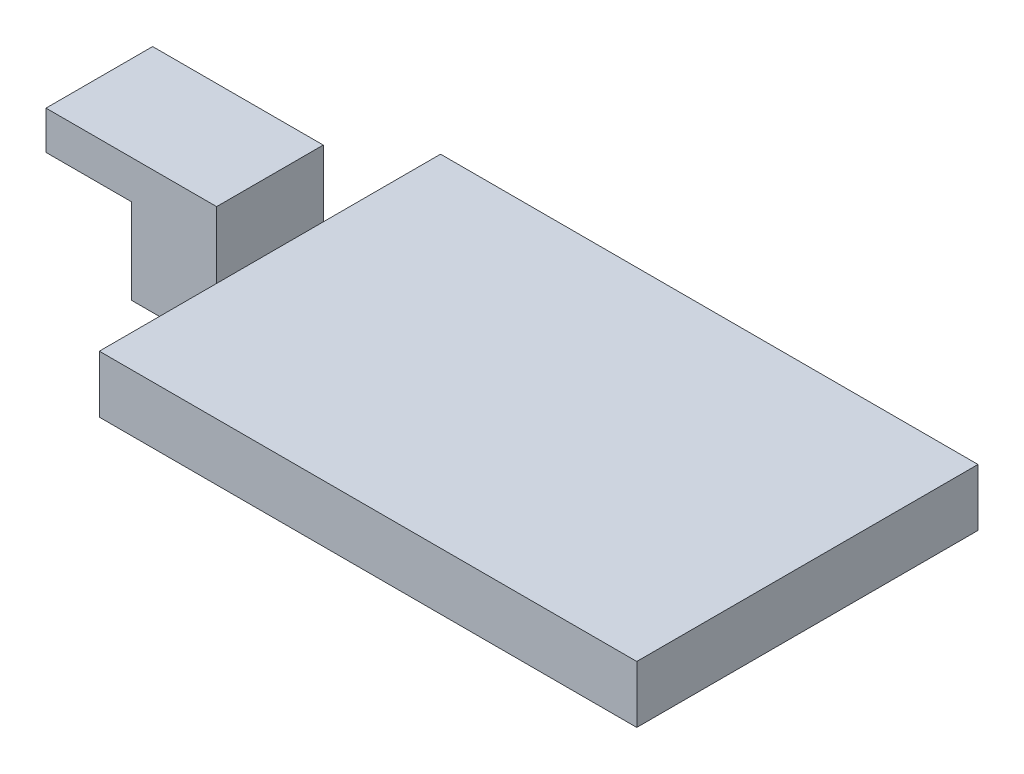
ISO-10303-21;
HEADER;
FILE_DESCRIPTION(('STEP AP214'),'2;1');
FILE_NAME('part.step','',(''),(''),'','','');
FILE_SCHEMA(('AUTOMOTIVE_DESIGN { 1 0 10303 214 1 1 1 1 }'));
ENDSEC;
DATA;
#1=APPLICATION_CONTEXT('core data for automotive mechanical design processes');
#2=APPLICATION_PROTOCOL_DEFINITION('international standard','automotive_design',2000,#1);
#3=PRODUCT_CONTEXT('',#1,'mechanical');
#4=PRODUCT('Part','Part','',(#3));
#5=PRODUCT_RELATED_PRODUCT_CATEGORY('part','',(#4));
#6=PRODUCT_DEFINITION_FORMATION('','',#4);
#7=PRODUCT_DEFINITION_CONTEXT('part definition',#1,'design');
#8=PRODUCT_DEFINITION('design','',#6,#7);
#9=PRODUCT_DEFINITION_SHAPE('','',#8);
#10=(LENGTH_UNIT() NAMED_UNIT(*) SI_UNIT(.MILLI.,.METRE.));
#11=(NAMED_UNIT(*) PLANE_ANGLE_UNIT() SI_UNIT($,.RADIAN.));
#12=(NAMED_UNIT(*) SI_UNIT($,.STERADIAN.) SOLID_ANGLE_UNIT());
#13=UNCERTAINTY_MEASURE_WITH_UNIT(LENGTH_MEASURE(1.E-05),#10,'distance_accuracy_value','');
#14=(GEOMETRIC_REPRESENTATION_CONTEXT(3) GLOBAL_UNCERTAINTY_ASSIGNED_CONTEXT((#13)) GLOBAL_UNIT_ASSIGNED_CONTEXT((#10,
#11,#12)) REPRESENTATION_CONTEXT('',''));
#15=CARTESIAN_POINT('',(0.,0.,0.));
#16=DIRECTION('',(0.,0.,1.));
#17=DIRECTION('',(1.,0.,0.));
#18=AXIS2_PLACEMENT_3D('',#15,#16,#17);
#19=CARTESIAN_POINT('',(10.16,2.286,0.));
#20=DIRECTION('',(-1.,0.,0.));
#21=DIRECTION('',(0.,0.,1.));
#22=AXIS2_PLACEMENT_3D('',#19,#20,#21);
#23=PLANE('',#22);
#24=DIRECTION('',(0.,0.,1.));
#25=VECTOR('',#24,1.);
#26=CARTESIAN_POINT('',(10.16,-1.6764,-13.335));
#27=LINE('',#26,#25);
#28=CARTESIAN_POINT('',(10.16,-1.6764,-6.35));
#29=VERTEX_POINT('',#28);
#30=CARTESIAN_POINT('',(10.16,-1.6764,0.));
#31=VERTEX_POINT('',#30);
#32=EDGE_CURVE('E11',#29,#31,#27,.T.);
#33=ORIENTED_EDGE('',*,*,#32,.F.);
#34=DIRECTION('',(0.,-1.,0.));
#35=VECTOR('',#34,1.);
#36=CARTESIAN_POINT('',(10.16,2.286,-6.35));
#37=LINE('',#36,#35);
#38=CARTESIAN_POINT('',(10.16,2.286,-6.35));
#39=VERTEX_POINT('',#38);
#40=EDGE_CURVE('E282',#39,#29,#37,.T.);
#41=ORIENTED_EDGE('',*,*,#40,.F.);
#42=DIRECTION('',(0.,0.,-1.));
#43=VECTOR('',#42,1.);
#44=CARTESIAN_POINT('',(10.16,2.286,0.));
#45=LINE('',#44,#43);
#46=CARTESIAN_POINT('',(10.16,2.286,0.));
#47=VERTEX_POINT('',#46);
#48=EDGE_CURVE('E263',#47,#39,#45,.T.);
#49=ORIENTED_EDGE('',*,*,#48,.F.);
#50=DIRECTION('',(0.,-1.,0.));
#51=VECTOR('',#50,1.);
#52=CARTESIAN_POINT('',(10.16,2.286,0.));
#53=LINE('',#52,#51);
#54=EDGE_CURVE('E285',#47,#31,#53,.T.);
#55=ORIENTED_EDGE('',*,*,#54,.T.);
#56=EDGE_LOOP('',(#33,#41,#49,#55));
#57=FACE_BOUND('',#56,.T.);
#58=ADVANCED_FACE('F45',(#57),#23,.F.);
#59=CARTESIAN_POINT('',(0.,2.286,0.));
#60=DIRECTION('',(1.,0.,0.));
#61=DIRECTION('',(0.,0.,-1.));
#62=AXIS2_PLACEMENT_3D('',#59,#60,#61);
#63=PLANE('',#62);
#64=DIRECTION('',(0.,0.,1.));
#65=VECTOR('',#64,1.);
#66=CARTESIAN_POINT('',(0.,0.203199999999999,-6.0452));
#67=LINE('',#66,#65);
#68=CARTESIAN_POINT('',(0.,0.203199999999999,-6.0452));
#69=VERTEX_POINT('',#68);
#70=CARTESIAN_POINT('',(0.,0.2032,-0.2032));
#71=VERTEX_POINT('',#70);
#72=EDGE_CURVE('E231',#69,#71,#67,.T.);
#73=ORIENTED_EDGE('',*,*,#72,.F.);
#74=DIRECTION('',(0.,-1.,0.));
#75=VECTOR('',#74,1.);
#76=CARTESIAN_POINT('',(0.,1.9812,-6.0452));
#77=LINE('',#76,#75);
#78=CARTESIAN_POINT('',(0.,1.9812,-6.0452));
#79=VERTEX_POINT('',#78);
#80=EDGE_CURVE('E210',#79,#69,#77,.T.);
#81=ORIENTED_EDGE('',*,*,#80,.F.);
#82=DIRECTION('',(0.,0.,-1.));
#83=VECTOR('',#82,1.);
#84=CARTESIAN_POINT('',(0.,1.9812,-6.0452));
#85=LINE('',#84,#83);
#86=CARTESIAN_POINT('',(0.,1.9812,-0.2032));
#87=VERTEX_POINT('',#86);
#88=EDGE_CURVE('E216',#87,#79,#85,.T.);
#89=ORIENTED_EDGE('',*,*,#88,.F.);
#90=DIRECTION('',(0.,1.,0.));
#91=VECTOR('',#90,1.);
#92=CARTESIAN_POINT('',(0.,1.9812,-0.2032));
#93=LINE('',#92,#91);
#94=EDGE_CURVE('E235',#71,#87,#93,.T.);
#95=ORIENTED_EDGE('',*,*,#94,.F.);
#96=EDGE_LOOP('',(#73,#81,#89,#95));
#97=FACE_BOUND('',#96,.T.);
#98=DIRECTION('',(0.,0.,1.));
#99=VECTOR('',#98,1.);
#100=CARTESIAN_POINT('',(0.,0.,0.));
#101=LINE('',#100,#99);
#102=CARTESIAN_POINT('',(0.,0.,-6.35));
#103=VERTEX_POINT('',#102);
#104=CARTESIAN_POINT('',(0.,0.,0.));
#105=VERTEX_POINT('',#104);
#106=EDGE_CURVE('E245',#103,#105,#101,.T.);
#107=ORIENTED_EDGE('',*,*,#106,.T.);
#108=DIRECTION('',(0.,-1.,0.));
#109=VECTOR('',#108,1.);
#110=CARTESIAN_POINT('',(0.,2.286,0.));
#111=LINE('',#110,#109);
#112=CARTESIAN_POINT('',(0.,2.286,0.));
#113=VERTEX_POINT('',#112);
#114=EDGE_CURVE('E49',#113,#105,#111,.T.);
#115=ORIENTED_EDGE('',*,*,#114,.F.);
#116=DIRECTION('',(0.,0.,1.));
#117=VECTOR('',#116,1.);
#118=CARTESIAN_POINT('',(0.,2.286,0.));
#119=LINE('',#118,#117);
#120=CARTESIAN_POINT('',(0.,2.286,-6.35));
#121=VERTEX_POINT('',#120);
#122=EDGE_CURVE('E255',#121,#113,#119,.T.);
#123=ORIENTED_EDGE('',*,*,#122,.F.);
#124=DIRECTION('',(0.,-1.,0.));
#125=VECTOR('',#124,1.);
#126=CARTESIAN_POINT('',(0.,2.286,-6.35));
#127=LINE('',#126,#125);
#128=EDGE_CURVE('E269',#121,#103,#127,.T.);
#129=ORIENTED_EDGE('',*,*,#128,.T.);
#130=EDGE_LOOP('',(#107,#115,#123,#129));
#131=FACE_BOUND('',#130,.T.);
#132=ADVANCED_FACE('F47',(#97,#131),#63,.F.);
#133=CARTESIAN_POINT('',(0.,2.286,0.));
#134=DIRECTION('',(0.,0.,-1.));
#135=DIRECTION('',(-1.,0.,0.));
#136=AXIS2_PLACEMENT_3D('',#133,#134,#135);
#137=PLANE('',#136);
#138=DIRECTION('',(1.,0.,0.));
#139=VECTOR('',#138,1.);
#140=CARTESIAN_POINT('',(0.,0.,0.));
#141=LINE('',#140,#139);
#142=CARTESIAN_POINT('',(5.08,0.,0.));
#143=VERTEX_POINT('',#142);
#144=EDGE_CURVE('E273',#105,#143,#141,.T.);
#145=ORIENTED_EDGE('',*,*,#144,.T.);
#146=DIRECTION('',(0.,1.,0.));
#147=VECTOR('',#146,1.);
#148=CARTESIAN_POINT('',(5.08,-5.08,0.));
#149=LINE('',#148,#147);
#150=CARTESIAN_POINT('',(5.08,-5.08,0.));
#151=VERTEX_POINT('',#150);
#152=EDGE_CURVE('E206',#151,#143,#149,.T.);
#153=ORIENTED_EDGE('',*,*,#152,.F.);
#154=DIRECTION('',(-1.,0.,0.));
#155=VECTOR('',#154,1.);
#156=CARTESIAN_POINT('',(10.16,-5.08,0.));
#157=LINE('',#156,#155);
#158=CARTESIAN_POINT('',(10.16,-5.08,0.));
#159=VERTEX_POINT('',#158);
#160=EDGE_CURVE('E187',#159,#151,#157,.T.);
#161=ORIENTED_EDGE('',*,*,#160,.F.);
#162=EDGE_CURVE('E284',#31,#159,#53,.T.);
#163=ORIENTED_EDGE('',*,*,#162,.F.);
#164=ORIENTED_EDGE('',*,*,#54,.F.);
#165=DIRECTION('',(1.,0.,0.));
#166=VECTOR('',#165,1.);
#167=CARTESIAN_POINT('',(0.,2.286,0.));
#168=LINE('',#167,#166);
#169=EDGE_CURVE('E259',#113,#47,#168,.T.);
#170=ORIENTED_EDGE('',*,*,#169,.F.);
#171=ORIENTED_EDGE('',*,*,#114,.T.);
#172=EDGE_LOOP('',(#145,#153,#161,#163,#164,#170,#171));
#173=FACE_BOUND('',#172,.T.);
#174=ADVANCED_FACE('F346',(#173),#137,.F.);
#175=CARTESIAN_POINT('',(0.,2.286,-6.35));
#176=DIRECTION('',(0.,0.,1.));
#177=DIRECTION('',(1.,0.,0.));
#178=AXIS2_PLACEMENT_3D('',#175,#176,#177);
#179=PLANE('',#178);
#180=ORIENTED_EDGE('',*,*,#40,.T.);
#181=CARTESIAN_POINT('',(10.16,-5.08,-6.35));
#182=VERTEX_POINT('',#181);
#183=EDGE_CURVE('E281',#29,#182,#37,.T.);
#184=ORIENTED_EDGE('',*,*,#183,.T.);
#185=DIRECTION('',(1.,0.,0.));
#186=VECTOR('',#185,1.);
#187=CARTESIAN_POINT('',(10.16,-5.08,-6.35));
#188=LINE('',#187,#186);
#189=CARTESIAN_POINT('',(5.08,-5.08,-6.35));
#190=VERTEX_POINT('',#189);
#191=EDGE_CURVE('E198',#190,#182,#188,.T.);
#192=ORIENTED_EDGE('',*,*,#191,.F.);
#193=DIRECTION('',(0.,1.,0.));
#194=VECTOR('',#193,1.);
#195=CARTESIAN_POINT('',(5.08,-5.08,-6.35));
#196=LINE('',#195,#194);
#197=CARTESIAN_POINT('',(5.08,0.,-6.35));
#198=VERTEX_POINT('',#197);
#199=EDGE_CURVE('E201',#190,#198,#196,.T.);
#200=ORIENTED_EDGE('',*,*,#199,.T.);
#201=DIRECTION('',(-1.,0.,0.));
#202=VECTOR('',#201,1.);
#203=CARTESIAN_POINT('',(0.,0.,-6.35));
#204=LINE('',#203,#202);
#205=EDGE_CURVE('E260',#198,#103,#204,.T.);
#206=ORIENTED_EDGE('',*,*,#205,.T.);
#207=ORIENTED_EDGE('',*,*,#128,.F.);
#208=DIRECTION('',(-1.,0.,0.));
#209=VECTOR('',#208,1.);
#210=CARTESIAN_POINT('',(0.,2.286,-6.35));
#211=LINE('',#210,#209);
#212=EDGE_CURVE('E266',#39,#121,#211,.T.);
#213=ORIENTED_EDGE('',*,*,#212,.F.);
#214=EDGE_LOOP('',(#180,#184,#192,#200,#206,#207,#213));
#215=FACE_BOUND('',#214,.T.);
#216=ADVANCED_FACE('F334',(#215),#179,.F.);
#217=CARTESIAN_POINT('',(0.,2.286,0.));
#218=DIRECTION('',(0.,-1.,0.));
#219=DIRECTION('',(0.,0.,-1.));
#220=AXIS2_PLACEMENT_3D('',#217,#218,#219);
#221=PLANE('',#220);
#222=ORIENTED_EDGE('',*,*,#122,.T.);
#223=ORIENTED_EDGE('',*,*,#169,.T.);
#224=ORIENTED_EDGE('',*,*,#48,.T.);
#225=ORIENTED_EDGE('',*,*,#212,.T.);
#226=EDGE_LOOP('',(#222,#223,#224,#225));
#227=FACE_BOUND('',#226,.T.);
#228=ADVANCED_FACE('F348',(#227),#221,.F.);
#229=CARTESIAN_POINT('',(0.,0.,0.));
#230=DIRECTION('',(0.,-1.,0.));
#231=DIRECTION('',(0.,0.,-1.));
#232=AXIS2_PLACEMENT_3D('',#229,#230,#231);
#233=PLANE('',#232);
#234=DIRECTION('',(0.,0.,-1.));
#235=VECTOR('',#234,1.);
#236=CARTESIAN_POINT('',(5.08,0.,-6.35));
#237=LINE('',#236,#235);
#238=EDGE_CURVE('E70',#143,#198,#237,.T.);
#239=ORIENTED_EDGE('',*,*,#238,.F.);
#240=ORIENTED_EDGE('',*,*,#144,.F.);
#241=ORIENTED_EDGE('',*,*,#106,.F.);
#242=ORIENTED_EDGE('',*,*,#205,.F.);
#243=EDGE_LOOP('',(#239,#240,#241,#242));
#244=FACE_BOUND('',#243,.T.);
#245=ADVANCED_FACE('F345',(#244),#233,.T.);
#246=CARTESIAN_POINT('',(8.89,1.9812,-6.0452));
#247=DIRECTION('',(0.,0.,-1.));
#248=DIRECTION('',(0.,1.,0.));
#249=AXIS2_PLACEMENT_3D('',#246,#247,#248);
#250=PLANE('',#249);
#251=ORIENTED_EDGE('',*,*,#80,.T.);
#252=DIRECTION('',(-1.,0.,0.));
#253=VECTOR('',#252,1.);
#254=CARTESIAN_POINT('',(8.89,0.203199999999999,-6.0452));
#255=LINE('',#254,#253);
#256=CARTESIAN_POINT('',(8.89,0.203199999999999,-6.0452));
#257=VERTEX_POINT('',#256);
#258=EDGE_CURVE('E228',#257,#69,#255,.T.);
#259=ORIENTED_EDGE('',*,*,#258,.F.);
#260=DIRECTION('',(0.,-1.,0.));
#261=VECTOR('',#260,1.);
#262=CARTESIAN_POINT('',(8.89,1.9812,-6.0452));
#263=LINE('',#262,#261);
#264=CARTESIAN_POINT('',(8.89,1.9812,-6.0452));
#265=VERTEX_POINT('',#264);
#266=EDGE_CURVE('E211',#265,#257,#263,.T.);
#267=ORIENTED_EDGE('',*,*,#266,.F.);
#268=DIRECTION('',(-1.,0.,0.));
#269=VECTOR('',#268,1.);
#270=CARTESIAN_POINT('',(8.89,1.9812,-6.0452));
#271=LINE('',#270,#269);
#272=EDGE_CURVE('E242',#265,#79,#271,.T.);
#273=ORIENTED_EDGE('',*,*,#272,.T.);
#274=EDGE_LOOP('',(#251,#259,#267,#273));
#275=FACE_BOUND('',#274,.T.);
#276=ADVANCED_FACE('F370',(#275),#250,.F.);
#277=CARTESIAN_POINT('',(8.89,1.9812,-6.0452));
#278=DIRECTION('',(0.,1.,0.));
#279=DIRECTION('',(0.,0.,1.));
#280=AXIS2_PLACEMENT_3D('',#277,#278,#279);
#281=PLANE('',#280);
#282=ORIENTED_EDGE('',*,*,#88,.T.);
#283=ORIENTED_EDGE('',*,*,#272,.F.);
#284=DIRECTION('',(0.,0.,-1.));
#285=VECTOR('',#284,1.);
#286=CARTESIAN_POINT('',(8.89,1.9812,-6.0452));
#287=LINE('',#286,#285);
#288=CARTESIAN_POINT('',(8.89,1.9812,-0.2032));
#289=VERTEX_POINT('',#288);
#290=EDGE_CURVE('E224',#289,#265,#287,.T.);
#291=ORIENTED_EDGE('',*,*,#290,.F.);
#292=DIRECTION('',(-1.,0.,0.));
#293=VECTOR('',#292,1.);
#294=CARTESIAN_POINT('',(8.89,1.9812,-0.2032));
#295=LINE('',#294,#293);
#296=EDGE_CURVE('E246',#289,#87,#295,.T.);
#297=ORIENTED_EDGE('',*,*,#296,.T.);
#298=EDGE_LOOP('',(#282,#283,#291,#297));
#299=FACE_BOUND('',#298,.T.);
#300=ADVANCED_FACE('F374',(#299),#281,.F.);
#301=CARTESIAN_POINT('',(8.89,1.9812,-0.2032));
#302=DIRECTION('',(0.,0.,1.));
#303=DIRECTION('',(1.,0.,0.));
#304=AXIS2_PLACEMENT_3D('',#301,#302,#303);
#305=PLANE('',#304);
#306=ORIENTED_EDGE('',*,*,#94,.T.);
#307=ORIENTED_EDGE('',*,*,#296,.F.);
#308=DIRECTION('',(0.,1.,0.));
#309=VECTOR('',#308,1.);
#310=CARTESIAN_POINT('',(8.89,1.9812,-0.2032));
#311=LINE('',#310,#309);
#312=CARTESIAN_POINT('',(8.89,0.2032,-0.2032));
#313=VERTEX_POINT('',#312);
#314=EDGE_CURVE('E220',#313,#289,#311,.T.);
#315=ORIENTED_EDGE('',*,*,#314,.F.);
#316=DIRECTION('',(-1.,0.,0.));
#317=VECTOR('',#316,1.);
#318=CARTESIAN_POINT('',(8.89,0.2032,-0.2032));
#319=LINE('',#318,#317);
#320=EDGE_CURVE('E249',#313,#71,#319,.T.);
#321=ORIENTED_EDGE('',*,*,#320,.T.);
#322=EDGE_LOOP('',(#306,#307,#315,#321));
#323=FACE_BOUND('',#322,.T.);
#324=ADVANCED_FACE('F380',(#323),#305,.F.);
#325=CARTESIAN_POINT('',(8.89,0.203199999999999,-6.0452));
#326=DIRECTION('',(0.,-1.,0.));
#327=DIRECTION('',(0.,0.,-1.));
#328=AXIS2_PLACEMENT_3D('',#325,#326,#327);
#329=PLANE('',#328);
#330=ORIENTED_EDGE('',*,*,#72,.T.);
#331=ORIENTED_EDGE('',*,*,#320,.F.);
#332=DIRECTION('',(0.,0.,1.));
#333=VECTOR('',#332,1.);
#334=CARTESIAN_POINT('',(8.89,0.203199999999999,-6.0452));
#335=LINE('',#334,#333);
#336=EDGE_CURVE('E215',#257,#313,#335,.T.);
#337=ORIENTED_EDGE('',*,*,#336,.F.);
#338=ORIENTED_EDGE('',*,*,#258,.T.);
#339=EDGE_LOOP('',(#330,#331,#337,#338));
#340=FACE_BOUND('',#339,.T.);
#341=ADVANCED_FACE('F376',(#340),#329,.F.);
#342=CARTESIAN_POINT('',(8.89,0.,0.));
#343=DIRECTION('',(-1.,0.,0.));
#344=DIRECTION('',(0.,0.,1.));
#345=AXIS2_PLACEMENT_3D('',#342,#343,#344);
#346=PLANE('',#345);
#347=ORIENTED_EDGE('',*,*,#266,.T.);
#348=ORIENTED_EDGE('',*,*,#336,.T.);
#349=ORIENTED_EDGE('',*,*,#314,.T.);
#350=ORIENTED_EDGE('',*,*,#290,.T.);
#351=EDGE_LOOP('',(#347,#348,#349,#350));
#352=FACE_BOUND('',#351,.T.);
#353=ADVANCED_FACE('F379',(#352),#346,.T.);
#354=CARTESIAN_POINT('',(5.08,-5.08,-6.35));
#355=DIRECTION('',(1.,0.,0.));
#356=DIRECTION('',(0.,0.,-1.));
#357=AXIS2_PLACEMENT_3D('',#354,#355,#356);
#358=PLANE('',#357);
#359=ORIENTED_EDGE('',*,*,#238,.T.);
#360=ORIENTED_EDGE('',*,*,#199,.F.);
#361=DIRECTION('',(0.,0.,-1.));
#362=VECTOR('',#361,1.);
#363=CARTESIAN_POINT('',(5.08,-5.08,-6.35));
#364=LINE('',#363,#362);
#365=EDGE_CURVE('E195',#151,#190,#364,.T.);
#366=ORIENTED_EDGE('',*,*,#365,.F.);
#367=ORIENTED_EDGE('',*,*,#152,.T.);
#368=EDGE_LOOP('',(#359,#360,#366,#367));
#369=FACE_BOUND('',#368,.T.);
#370=ADVANCED_FACE('F339',(#369),#358,.F.);
#371=CARTESIAN_POINT('',(0.,-5.08,0.));
#372=DIRECTION('',(0.,-1.,0.));
#373=DIRECTION('',(0.,0.,-1.));
#374=AXIS2_PLACEMENT_3D('',#371,#372,#373);
#375=PLANE('',#374);
#376=ORIENTED_EDGE('',*,*,#191,.T.);
#377=DIRECTION('',(0.,0.,-1.));
#378=VECTOR('',#377,1.);
#379=CARTESIAN_POINT('',(10.16,-5.08,-13.335));
#380=LINE('',#379,#378);
#381=CARTESIAN_POINT('',(10.16,-5.08,-13.335));
#382=VERTEX_POINT('',#381);
#383=EDGE_CURVE('E307',#182,#382,#380,.T.);
#384=ORIENTED_EDGE('',*,*,#383,.T.);
#385=DIRECTION('',(-1.,0.,0.));
#386=VECTOR('',#385,1.);
#387=CARTESIAN_POINT('',(42.164,-5.08,-13.335));
#388=LINE('',#387,#386);
#389=CARTESIAN_POINT('',(42.164,-5.08,-13.335));
#390=VERTEX_POINT('',#389);
#391=EDGE_CURVE('E313',#390,#382,#388,.T.);
#392=ORIENTED_EDGE('',*,*,#391,.F.);
#393=DIRECTION('',(0.,0.,-1.));
#394=VECTOR('',#393,1.);
#395=CARTESIAN_POINT('',(42.164,-5.08,-13.335));
#396=LINE('',#395,#394);
#397=CARTESIAN_POINT('',(42.164,-5.08,6.985));
#398=VERTEX_POINT('',#397);
#399=EDGE_CURVE('E173',#398,#390,#396,.T.);
#400=ORIENTED_EDGE('',*,*,#399,.F.);
#401=DIRECTION('',(-1.,0.,0.));
#402=VECTOR('',#401,1.);
#403=CARTESIAN_POINT('',(42.164,-5.08,6.985));
#404=LINE('',#403,#402);
#405=CARTESIAN_POINT('',(10.16,-5.08,6.985));
#406=VERTEX_POINT('',#405);
#407=EDGE_CURVE('E189',#398,#406,#404,.T.);
#408=ORIENTED_EDGE('',*,*,#407,.T.);
#409=EDGE_CURVE('E178',#406,#159,#380,.T.);
#410=ORIENTED_EDGE('',*,*,#409,.T.);
#411=ORIENTED_EDGE('',*,*,#160,.T.);
#412=ORIENTED_EDGE('',*,*,#365,.T.);
#413=EDGE_LOOP('',(#376,#384,#392,#400,#408,#410,#411,#412));
#414=FACE_BOUND('',#413,.T.);
#415=ADVANCED_FACE('F303',(#414),#375,.T.);
#416=CARTESIAN_POINT('',(10.16,0.,0.));
#417=DIRECTION('',(1.,0.,0.));
#418=DIRECTION('',(0.,0.,-1.));
#419=AXIS2_PLACEMENT_3D('',#416,#417,#418);
#420=PLANE('',#419);
#421=CARTESIAN_POINT('',(10.16,-1.6764,6.985));
#422=VERTEX_POINT('',#421);
#423=EDGE_CURVE('E57',#31,#422,#27,.T.);
#424=ORIENTED_EDGE('',*,*,#423,.F.);
#425=ORIENTED_EDGE('',*,*,#162,.T.);
#426=ORIENTED_EDGE('',*,*,#409,.F.);
#427=DIRECTION('',(0.,-1.,0.));
#428=VECTOR('',#427,1.);
#429=CARTESIAN_POINT('',(10.16,-5.08,6.985));
#430=LINE('',#429,#428);
#431=EDGE_CURVE('E310',#422,#406,#430,.T.);
#432=ORIENTED_EDGE('',*,*,#431,.F.);
#433=EDGE_LOOP('',(#424,#425,#426,#432));
#434=FACE_BOUND('',#433,.T.);
#435=ADVANCED_FACE('F298',(#434),#420,.F.);
#436=CARTESIAN_POINT('',(42.164,-5.08,-13.335));
#437=DIRECTION('',(0.,0.,1.));
#438=DIRECTION('',(1.,0.,0.));
#439=AXIS2_PLACEMENT_3D('',#436,#437,#438);
#440=PLANE('',#439);
#441=DIRECTION('',(0.,1.,0.));
#442=VECTOR('',#441,1.);
#443=CARTESIAN_POINT('',(10.16,-5.08,-13.335));
#444=LINE('',#443,#442);
#445=CARTESIAN_POINT('',(10.16,-1.6764,-13.335));
#446=VERTEX_POINT('',#445);
#447=EDGE_CURVE('E182',#382,#446,#444,.T.);
#448=ORIENTED_EDGE('',*,*,#447,.T.);
#449=DIRECTION('',(-1.,0.,0.));
#450=VECTOR('',#449,1.);
#451=CARTESIAN_POINT('',(42.164,-1.6764,-13.335));
#452=LINE('',#451,#450);
#453=CARTESIAN_POINT('',(42.164,-1.6764,-13.335));
#454=VERTEX_POINT('',#453);
#455=EDGE_CURVE('E160',#454,#446,#452,.T.);
#456=ORIENTED_EDGE('',*,*,#455,.F.);
#457=DIRECTION('',(0.,1.,0.));
#458=VECTOR('',#457,1.);
#459=CARTESIAN_POINT('',(42.164,-5.08,-13.335));
#460=LINE('',#459,#458);
#461=EDGE_CURVE('E168',#390,#454,#460,.T.);
#462=ORIENTED_EDGE('',*,*,#461,.F.);
#463=ORIENTED_EDGE('',*,*,#391,.T.);
#464=EDGE_LOOP('',(#448,#456,#462,#463));
#465=FACE_BOUND('',#464,.T.);
#466=ADVANCED_FACE('F180',(#465),#440,.F.);
#467=CARTESIAN_POINT('',(42.164,-1.6764,-13.335));
#468=DIRECTION('',(0.,-1.,0.));
#469=DIRECTION('',(0.,0.,-1.));
#470=AXIS2_PLACEMENT_3D('',#467,#468,#469);
#471=PLANE('',#470);
#472=EDGE_CURVE('E56',#446,#29,#27,.T.);
#473=ORIENTED_EDGE('',*,*,#472,.T.);
#474=ORIENTED_EDGE('',*,*,#32,.T.);
#475=ORIENTED_EDGE('',*,*,#423,.T.);
#476=DIRECTION('',(-1.,0.,0.));
#477=VECTOR('',#476,1.);
#478=CARTESIAN_POINT('',(42.164,-1.6764,6.985));
#479=LINE('',#478,#477);
#480=CARTESIAN_POINT('',(42.164,-1.6764,6.985));
#481=VERTEX_POINT('',#480);
#482=EDGE_CURVE('E163',#481,#422,#479,.T.);
#483=ORIENTED_EDGE('',*,*,#482,.F.);
#484=DIRECTION('',(0.,0.,1.));
#485=VECTOR('',#484,1.);
#486=CARTESIAN_POINT('',(42.164,-1.6764,-13.335));
#487=LINE('',#486,#485);
#488=EDGE_CURVE('E155',#454,#481,#487,.T.);
#489=ORIENTED_EDGE('',*,*,#488,.F.);
#490=ORIENTED_EDGE('',*,*,#455,.T.);
#491=EDGE_LOOP('',(#473,#474,#475,#483,#489,#490));
#492=FACE_BOUND('',#491,.T.);
#493=ADVANCED_FACE('F158',(#492),#471,.F.);
#494=CARTESIAN_POINT('',(42.164,-5.08,6.985));
#495=DIRECTION('',(0.,0.,-1.));
#496=DIRECTION('',(0.,1.,0.));
#497=AXIS2_PLACEMENT_3D('',#494,#495,#496);
#498=PLANE('',#497);
#499=ORIENTED_EDGE('',*,*,#431,.T.);
#500=ORIENTED_EDGE('',*,*,#407,.F.);
#501=DIRECTION('',(0.,-1.,0.));
#502=VECTOR('',#501,1.);
#503=CARTESIAN_POINT('',(42.164,-5.08,6.985));
#504=LINE('',#503,#502);
#505=EDGE_CURVE('E167',#481,#398,#504,.T.);
#506=ORIENTED_EDGE('',*,*,#505,.F.);
#507=ORIENTED_EDGE('',*,*,#482,.T.);
#508=EDGE_LOOP('',(#499,#500,#506,#507));
#509=FACE_BOUND('',#508,.T.);
#510=ADVANCED_FACE('F326',(#509),#498,.F.);
#511=CARTESIAN_POINT('',(42.164,0.,0.));
#512=DIRECTION('',(1.,0.,0.));
#513=DIRECTION('',(0.,0.,-1.));
#514=AXIS2_PLACEMENT_3D('',#511,#512,#513);
#515=PLANE('',#514);
#516=ORIENTED_EDGE('',*,*,#461,.T.);
#517=ORIENTED_EDGE('',*,*,#488,.T.);
#518=ORIENTED_EDGE('',*,*,#505,.T.);
#519=ORIENTED_EDGE('',*,*,#399,.T.);
#520=EDGE_LOOP('',(#516,#517,#518,#519));
#521=FACE_BOUND('',#520,.T.);
#522=ADVANCED_FACE('F171',(#521),#515,.T.);
#523=ORIENTED_EDGE('',*,*,#183,.F.);
#524=ORIENTED_EDGE('',*,*,#472,.F.);
#525=ORIENTED_EDGE('',*,*,#447,.F.);
#526=ORIENTED_EDGE('',*,*,#383,.F.);
#527=EDGE_LOOP('',(#523,#524,#525,#526));
#528=FACE_BOUND('',#527,.T.);
#529=ADVANCED_FACE('F330',(#528),#420,.F.);
#530=CLOSED_SHELL('',(#58,#132,#174,#216,#228,#245,#276,#300,#324,#341,#353,#370,#415,#435,#466,
#493,#510,#522,#529));
#531=MANIFOLD_SOLID_BREP('B2',#530);
#532=ADVANCED_BREP_SHAPE_REPRESENTATION('',(#18,#531),#14);
#533=SHAPE_DEFINITION_REPRESENTATION(#9,#532);
ENDSEC;
END-ISO-10303-21;
